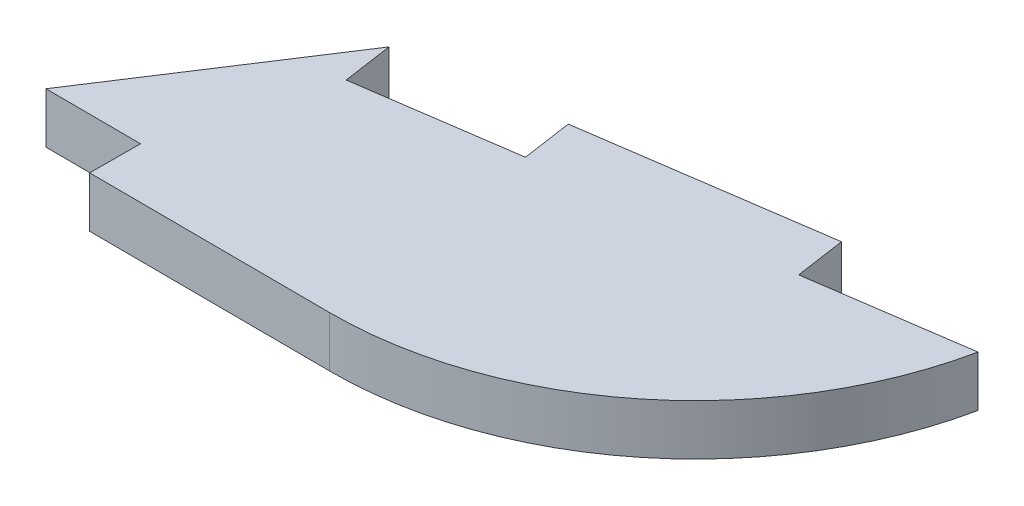
ISO-10303-21;
HEADER;
FILE_DESCRIPTION(('STEP AP214'),'2;1');
FILE_NAME('part.step','',(''),(''),'','','');
FILE_SCHEMA(('AUTOMOTIVE_DESIGN { 1 0 10303 214 1 1 1 1 }'));
ENDSEC;
DATA;
#1=APPLICATION_CONTEXT('core data for automotive mechanical design processes');
#2=APPLICATION_PROTOCOL_DEFINITION('international standard','automotive_design',2000,#1);
#3=PRODUCT_CONTEXT('',#1,'mechanical');
#4=PRODUCT('Part','Part','',(#3));
#5=PRODUCT_RELATED_PRODUCT_CATEGORY('part','',(#4));
#6=PRODUCT_DEFINITION_FORMATION('','',#4);
#7=PRODUCT_DEFINITION_CONTEXT('part definition',#1,'design');
#8=PRODUCT_DEFINITION('design','',#6,#7);
#9=PRODUCT_DEFINITION_SHAPE('','',#8);
#10=(LENGTH_UNIT() NAMED_UNIT(*) SI_UNIT(.MILLI.,.METRE.));
#11=(NAMED_UNIT(*) PLANE_ANGLE_UNIT() SI_UNIT($,.RADIAN.));
#12=(NAMED_UNIT(*) SI_UNIT($,.STERADIAN.) SOLID_ANGLE_UNIT());
#13=UNCERTAINTY_MEASURE_WITH_UNIT(LENGTH_MEASURE(1.E-05),#10,'distance_accuracy_value','');
#14=(GEOMETRIC_REPRESENTATION_CONTEXT(3) GLOBAL_UNCERTAINTY_ASSIGNED_CONTEXT((#13)) GLOBAL_UNIT_ASSIGNED_CONTEXT((#10,
#11,#12)) REPRESENTATION_CONTEXT('',''));
#15=CARTESIAN_POINT('',(0.,0.,0.));
#16=DIRECTION('',(0.,0.,1.));
#17=DIRECTION('',(1.,0.,0.));
#18=AXIS2_PLACEMENT_3D('',#15,#16,#17);
#19=CARTESIAN_POINT('',(18.5909943131763,0.8,-1.12747743329076));
#20=DIRECTION('',(0.00428128758795251,0.,-0.999990835246298));
#21=DIRECTION('',(-0.999990835246298,0.,-0.00428128758795251));
#22=AXIS2_PLACEMENT_3D('',#19,#20,#21);
#23=PLANE('',#22);
#24=DIRECTION('',(0.999990835246298,0.,0.00428128758795251));
#25=VECTOR('',#24,1.);
#26=CARTESIAN_POINT('',(18.5909943131763,-0.8,-1.12747743329076));
#27=LINE('',#26,#25);
#28=CARTESIAN_POINT('',(18.5909943131763,-0.8,-1.12747743329076));
#29=VERTEX_POINT('',#28);
#30=CARTESIAN_POINT('',(21.5909668189152,-0.8,-1.1146335705269));
#31=VERTEX_POINT('',#30);
#32=EDGE_CURVE('E149',#29,#31,#27,.T.);
#33=ORIENTED_EDGE('',*,*,#32,.T.);
#34=DIRECTION('',(0.,-1.,0.));
#35=VECTOR('',#34,1.);
#36=CARTESIAN_POINT('',(21.5909668189152,0.8,-1.1146335705269));
#37=LINE('',#36,#35);
#38=CARTESIAN_POINT('',(21.5909668189152,0.8,-1.1146335705269));
#39=VERTEX_POINT('',#38);
#40=EDGE_CURVE('E11',#39,#31,#37,.T.);
#41=ORIENTED_EDGE('',*,*,#40,.F.);
#42=DIRECTION('',(0.999990835246298,0.,0.00428128758795251));
#43=VECTOR('',#42,1.);
#44=CARTESIAN_POINT('',(18.5909943131763,0.8,-1.12747743329076));
#45=LINE('',#44,#43);
#46=CARTESIAN_POINT('',(18.5909943131763,0.8,-1.12747743329076));
#47=VERTEX_POINT('',#46);
#48=EDGE_CURVE('E169',#47,#39,#45,.T.);
#49=ORIENTED_EDGE('',*,*,#48,.F.);
#50=DIRECTION('',(0.,-1.,0.));
#51=VECTOR('',#50,1.);
#52=CARTESIAN_POINT('',(18.5909943131763,0.8,-1.12747743329076));
#53=LINE('',#52,#51);
#54=EDGE_CURVE('E145',#47,#29,#53,.T.);
#55=ORIENTED_EDGE('',*,*,#54,.T.);
#56=EDGE_LOOP('',(#33,#41,#49,#55));
#57=FACE_BOUND('',#56,.T.);
#58=ADVANCED_FACE('F35',(#57),#23,.F.);
#59=CARTESIAN_POINT('',(21.5909668189152,0.8,-1.1146335705269));
#60=DIRECTION('',(0.999990835246298,0.,0.00428128758795092));
#61=DIRECTION('',(0.00428128758795092,0.,-0.999990835246298));
#62=AXIS2_PLACEMENT_3D('',#59,#60,#61);
#63=PLANE('',#62);
#64=DIRECTION('',(-0.00428128758795092,0.,0.999990835246298));
#65=VECTOR('',#64,1.);
#66=CARTESIAN_POINT('',(21.5909668189152,-0.8,-1.1146335705269));
#67=LINE('',#66,#65);
#68=CARTESIAN_POINT('',(21.5841167587745,-0.8,0.485351765867176));
#69=VERTEX_POINT('',#68);
#70=EDGE_CURVE('E152',#31,#69,#67,.T.);
#71=ORIENTED_EDGE('',*,*,#70,.T.);
#72=DIRECTION('',(0.,-1.,0.));
#73=VECTOR('',#72,1.);
#74=CARTESIAN_POINT('',(21.5841167587745,0.8,0.485351765867176));
#75=LINE('',#74,#73);
#76=CARTESIAN_POINT('',(21.5841167587745,0.8,0.485351765867176));
#77=VERTEX_POINT('',#76);
#78=EDGE_CURVE('E43',#77,#69,#75,.T.);
#79=ORIENTED_EDGE('',*,*,#78,.F.);
#80=DIRECTION('',(-0.00428128758795092,0.,0.999990835246298));
#81=VECTOR('',#80,1.);
#82=CARTESIAN_POINT('',(21.5909668189152,0.8,-1.1146335705269));
#83=LINE('',#82,#81);
#84=EDGE_CURVE('E103',#39,#77,#83,.T.);
#85=ORIENTED_EDGE('',*,*,#84,.F.);
#86=ORIENTED_EDGE('',*,*,#40,.T.);
#87=EDGE_LOOP('',(#71,#79,#85,#86));
#88=FACE_BOUND('',#87,.T.);
#89=ADVANCED_FACE('F241',(#88),#63,.F.);
#90=CARTESIAN_POINT('',(21.5841167587745,0.8,0.485351765867176));
#91=DIRECTION('',(0.00428128758795139,0.,-0.999990835246298));
#92=DIRECTION('',(-0.999990835246298,0.,-0.00428128758795139));
#93=AXIS2_PLACEMENT_3D('',#90,#91,#92);
#94=PLANE('',#93);
#95=DIRECTION('',(0.999990835246298,0.,0.00428128758795139));
#96=VECTOR('',#95,1.);
#97=CARTESIAN_POINT('',(21.5841167587745,-0.8,0.485351765867176));
#98=LINE('',#97,#96);
#99=CARTESIAN_POINT('',(29.2040469233513,-0.8,0.517975177287365));
#100=VERTEX_POINT('',#99);
#101=EDGE_CURVE('E154',#69,#100,#98,.T.);
#102=ORIENTED_EDGE('',*,*,#101,.T.);
#103=DIRECTION('',(0.,-1.,0.));
#104=VECTOR('',#103,1.);
#105=CARTESIAN_POINT('',(29.2040469233513,0.8,0.517975177287365));
#106=LINE('',#105,#104);
#107=CARTESIAN_POINT('',(29.2040469233513,0.8,0.517975177287365));
#108=VERTEX_POINT('',#107);
#109=EDGE_CURVE('E185',#108,#100,#106,.T.);
#110=ORIENTED_EDGE('',*,*,#109,.F.);
#111=DIRECTION('',(0.999990835246298,0.,0.00428128758795139));
#112=VECTOR('',#111,1.);
#113=CARTESIAN_POINT('',(21.5841167587745,0.8,0.485351765867176));
#114=LINE('',#113,#112);
#115=EDGE_CURVE('E193',#77,#108,#114,.T.);
#116=ORIENTED_EDGE('',*,*,#115,.F.);
#117=ORIENTED_EDGE('',*,*,#78,.T.);
#118=EDGE_LOOP('',(#102,#110,#116,#117));
#119=FACE_BOUND('',#118,.T.);
#120=ADVANCED_FACE('F191',(#119),#94,.F.);
#121=CARTESIAN_POINT('',(29.2533795677285,0.8,-11.0047714829704));
#122=DIRECTION('',(0.,-1.,0.));
#123=DIRECTION('',(0.,0.,-1.));
#124=AXIS2_PLACEMENT_3D('',#121,#122,#123);
#125=CYLINDRICAL_SURFACE('',#124,11.5228522643607);
#126=CARTESIAN_POINT('',(29.2533795677285,-0.8,-11.0047714829704));
#127=DIRECTION('',(0.,1.,0.));
#128=DIRECTION('',(0.,0.,1.));
#129=AXIS2_PLACEMENT_3D('',#126,#127,#128);
#130=CIRCLE('',#129,11.5228522643607);
#131=CARTESIAN_POINT('',(40.5332201400788,-0.8,-8.65077042760888));
#132=VERTEX_POINT('',#131);
#133=EDGE_CURVE('E156',#100,#132,#130,.T.);
#134=ORIENTED_EDGE('',*,*,#133,.T.);
#135=DIRECTION('',(0.,-1.,0.));
#136=VECTOR('',#135,1.);
#137=CARTESIAN_POINT('',(40.5332201400788,0.8,-8.65077042760888));
#138=LINE('',#137,#136);
#139=CARTESIAN_POINT('',(40.5332201400788,0.8,-8.65077042760888));
#140=VERTEX_POINT('',#139);
#141=EDGE_CURVE('E182',#140,#132,#138,.T.);
#142=ORIENTED_EDGE('',*,*,#141,.F.);
#143=CARTESIAN_POINT('',(29.2533795677285,0.8,-11.0047714829704));
#144=DIRECTION('',(0.,1.,0.));
#145=DIRECTION('',(0.,0.,1.));
#146=AXIS2_PLACEMENT_3D('',#143,#144,#145);
#147=CIRCLE('',#146,11.5228522643607);
#148=EDGE_CURVE('E211',#108,#140,#147,.T.);
#149=ORIENTED_EDGE('',*,*,#148,.F.);
#150=ORIENTED_EDGE('',*,*,#109,.T.);
#151=EDGE_LOOP('',(#134,#142,#149,#150));
#152=FACE_BOUND('',#151,.T.);
#153=ADVANCED_FACE('F202',(#152),#125,.T.);
#154=CARTESIAN_POINT('',(40.5332201400788,0.8,-8.65077042760888));
#155=DIRECTION('',(0.144143926418042,0.,0.989556733329015));
#156=DIRECTION('',(0.989556733329014,0.,-0.144143926418042));
#157=AXIS2_PLACEMENT_3D('',#154,#155,#156);
#158=PLANE('',#157);
#159=DIRECTION('',(-0.989556733329015,0.,0.144143926418042));
#160=VECTOR('',#159,1.);
#161=CARTESIAN_POINT('',(40.5332201400788,-0.8,-8.65077042760888));
#162=LINE('',#161,#160);
#163=CARTESIAN_POINT('',(35.5854364734337,-0.8,-7.93005079551867));
#164=VERTEX_POINT('',#163);
#165=EDGE_CURVE('E158',#132,#164,#162,.T.);
#166=ORIENTED_EDGE('',*,*,#165,.T.);
#167=DIRECTION('',(0.,-1.,0.));
#168=VECTOR('',#167,1.);
#169=CARTESIAN_POINT('',(35.5854364734337,0.8,-7.93005079551867));
#170=LINE('',#169,#168);
#171=CARTESIAN_POINT('',(35.5854364734337,0.8,-7.93005079551867));
#172=VERTEX_POINT('',#171);
#173=EDGE_CURVE('E179',#172,#164,#170,.T.);
#174=ORIENTED_EDGE('',*,*,#173,.F.);
#175=DIRECTION('',(-0.989556733329015,0.,0.144143926418042));
#176=VECTOR('',#175,1.);
#177=CARTESIAN_POINT('',(40.5332201400788,0.8,-8.65077042760888));
#178=LINE('',#177,#176);
#179=EDGE_CURVE('E208',#140,#172,#178,.T.);
#180=ORIENTED_EDGE('',*,*,#179,.F.);
#181=ORIENTED_EDGE('',*,*,#141,.T.);
#182=EDGE_LOOP('',(#166,#174,#180,#181));
#183=FACE_BOUND('',#182,.T.);
#184=ADVANCED_FACE('F206',(#183),#158,.F.);
#185=CARTESIAN_POINT('',(35.5854364734337,0.8,-7.93005079551867));
#186=DIRECTION('',(-0.989556733329015,0.,0.144143926418036));
#187=DIRECTION('',(0.144143926418036,0.,0.989556733329015));
#188=AXIS2_PLACEMENT_3D('',#185,#186,#187);
#189=PLANE('',#188);
#190=DIRECTION('',(-0.144143926418036,0.,-0.989556733329015));
#191=VECTOR('',#190,1.);
#192=CARTESIAN_POINT('',(35.5854364734337,-0.8,-7.93005079551867));
#193=LINE('',#192,#191);
#194=CARTESIAN_POINT('',(35.3548061911649,-0.8,-9.5133415688451));
#195=VERTEX_POINT('',#194);
#196=EDGE_CURVE('E160',#164,#195,#193,.T.);
#197=ORIENTED_EDGE('',*,*,#196,.T.);
#198=DIRECTION('',(0.,-1.,0.));
#199=VECTOR('',#198,1.);
#200=CARTESIAN_POINT('',(35.3548061911649,0.8,-9.5133415688451));
#201=LINE('',#200,#199);
#202=CARTESIAN_POINT('',(35.3548061911649,0.8,-9.5133415688451));
#203=VERTEX_POINT('',#202);
#204=EDGE_CURVE('E176',#203,#195,#201,.T.);
#205=ORIENTED_EDGE('',*,*,#204,.F.);
#206=DIRECTION('',(-0.144143926418036,0.,-0.989556733329015));
#207=VECTOR('',#206,1.);
#208=CARTESIAN_POINT('',(35.5854364734337,0.8,-7.93005079551867));
#209=LINE('',#208,#207);
#210=EDGE_CURVE('E210',#172,#203,#209,.T.);
#211=ORIENTED_EDGE('',*,*,#210,.F.);
#212=ORIENTED_EDGE('',*,*,#173,.T.);
#213=EDGE_LOOP('',(#197,#205,#211,#212));
#214=FACE_BOUND('',#213,.T.);
#215=ADVANCED_FACE('F254',(#214),#189,.F.);
#216=CARTESIAN_POINT('',(35.3548061911649,0.8,-9.5133415688451));
#217=DIRECTION('',(0.144143926418041,0.,0.989556733329014));
#218=DIRECTION('',(0.989556733329015,0.,-0.144143926418042));
#219=AXIS2_PLACEMENT_3D('',#216,#217,#218);
#220=PLANE('',#219);
#221=DIRECTION('',(-0.989556733329014,0.,0.144143926418041));
#222=VECTOR('',#221,1.);
#223=CARTESIAN_POINT('',(35.3548061911649,-0.8,-9.5133415688451));
#224=LINE('',#223,#222);
#225=CARTESIAN_POINT('',(27.8143838831978,-0.8,-8.41496484953962));
#226=VERTEX_POINT('',#225);
#227=EDGE_CURVE('E162',#195,#226,#224,.T.);
#228=ORIENTED_EDGE('',*,*,#227,.T.);
#229=DIRECTION('',(0.,-1.,0.));
#230=VECTOR('',#229,1.);
#231=CARTESIAN_POINT('',(27.8143838831978,0.8,-8.41496484953962));
#232=LINE('',#231,#230);
#233=CARTESIAN_POINT('',(27.8143838831978,0.8,-8.41496484953962));
#234=VERTEX_POINT('',#233);
#235=EDGE_CURVE('E173',#234,#226,#232,.T.);
#236=ORIENTED_EDGE('',*,*,#235,.F.);
#237=DIRECTION('',(-0.989556733329014,0.,0.144143926418041));
#238=VECTOR('',#237,1.);
#239=CARTESIAN_POINT('',(35.3548061911649,0.8,-9.5133415688451));
#240=LINE('',#239,#238);
#241=EDGE_CURVE('E213',#203,#234,#240,.T.);
#242=ORIENTED_EDGE('',*,*,#241,.F.);
#243=ORIENTED_EDGE('',*,*,#204,.T.);
#244=EDGE_LOOP('',(#228,#236,#242,#243));
#245=FACE_BOUND('',#244,.T.);
#246=ADVANCED_FACE('F222',(#245),#220,.F.);
#247=CARTESIAN_POINT('',(27.8143838831978,0.8,-8.41496484953962));
#248=DIRECTION('',(0.989556733329016,0.,-0.144143926418035));
#249=DIRECTION('',(-0.144143926418035,0.,-0.989556733329016));
#250=AXIS2_PLACEMENT_3D('',#247,#248,#249);
#251=PLANE('',#250);
#252=DIRECTION('',(0.144143926418035,0.,0.989556733329016));
#253=VECTOR('',#252,1.);
#254=CARTESIAN_POINT('',(27.8143838831978,-0.8,-8.41496484953962));
#255=LINE('',#254,#253);
#256=CARTESIAN_POINT('',(28.0450141654666,-0.8,-6.83167407621319));
#257=VERTEX_POINT('',#256);
#258=EDGE_CURVE('E164',#226,#257,#255,.T.);
#259=ORIENTED_EDGE('',*,*,#258,.T.);
#260=DIRECTION('',(0.,-1.,0.));
#261=VECTOR('',#260,1.);
#262=CARTESIAN_POINT('',(28.0450141654666,0.8,-6.83167407621319));
#263=LINE('',#262,#261);
#264=CARTESIAN_POINT('',(28.0450141654666,0.8,-6.83167407621319));
#265=VERTEX_POINT('',#264);
#266=EDGE_CURVE('E140',#265,#257,#263,.T.);
#267=ORIENTED_EDGE('',*,*,#266,.F.);
#268=DIRECTION('',(0.144143926418035,0.,0.989556733329016));
#269=VECTOR('',#268,1.);
#270=CARTESIAN_POINT('',(27.8143838831978,0.8,-8.41496484953962));
#271=LINE('',#270,#269);
#272=EDGE_CURVE('E131',#234,#265,#271,.T.);
#273=ORIENTED_EDGE('',*,*,#272,.F.);
#274=ORIENTED_EDGE('',*,*,#235,.T.);
#275=EDGE_LOOP('',(#259,#267,#273,#274));
#276=FACE_BOUND('',#275,.T.);
#277=ADVANCED_FACE('F226',(#276),#251,.F.);
#278=CARTESIAN_POINT('',(28.0450141654666,0.8,-6.83167407621319));
#279=DIRECTION('',(0.14414392641804,0.,0.989556733329015));
#280=DIRECTION('',(0.989556733329015,0.,-0.14414392641804));
#281=AXIS2_PLACEMENT_3D('',#278,#279,#280);
#282=PLANE('',#281);
#283=DIRECTION('',(-0.989556733329015,0.,0.14414392641804));
#284=VECTOR('',#283,1.);
#285=CARTESIAN_POINT('',(28.0450141654666,-0.8,-6.83167407621319));
#286=LINE('',#285,#284);
#287=CARTESIAN_POINT('',(23.0972304988216,-0.8,-6.11095444412299));
#288=VERTEX_POINT('',#287);
#289=EDGE_CURVE('E139',#257,#288,#286,.T.);
#290=ORIENTED_EDGE('',*,*,#289,.T.);
#291=DIRECTION('',(0.,-1.,0.));
#292=VECTOR('',#291,1.);
#293=CARTESIAN_POINT('',(23.0972304988216,0.8,-6.11095444412299));
#294=LINE('',#293,#292);
#295=CARTESIAN_POINT('',(23.0972304988216,0.8,-6.11095444412299));
#296=VERTEX_POINT('',#295);
#297=EDGE_CURVE('E136',#296,#288,#294,.T.);
#298=ORIENTED_EDGE('',*,*,#297,.F.);
#299=DIRECTION('',(-0.989556733329015,0.,0.14414392641804));
#300=VECTOR('',#299,1.);
#301=CARTESIAN_POINT('',(28.0450141654666,0.8,-6.83167407621319));
#302=LINE('',#301,#300);
#303=EDGE_CURVE('E125',#265,#296,#302,.T.);
#304=ORIENTED_EDGE('',*,*,#303,.F.);
#305=ORIENTED_EDGE('',*,*,#266,.T.);
#306=EDGE_LOOP('',(#290,#298,#304,#305));
#307=FACE_BOUND('',#306,.T.);
#308=ADVANCED_FACE('F137',(#307),#282,.F.);
#309=CARTESIAN_POINT('',(23.0972304988216,0.8,-6.11095444412299));
#310=DIRECTION('',(-0.989556733329015,0.,0.144143926418036));
#311=DIRECTION('',(0.144143926418036,0.,0.989556733329015));
#312=AXIS2_PLACEMENT_3D('',#309,#310,#311);
#313=PLANE('',#312);
#314=DIRECTION('',(-0.144143926418036,0.,-0.989556733329015));
#315=VECTOR('',#314,1.);
#316=CARTESIAN_POINT('',(23.0972304988216,-0.8,-6.11095444412299));
#317=LINE('',#316,#315);
#318=CARTESIAN_POINT('',(22.8666002165527,-0.8,-7.69424521744941));
#319=VERTEX_POINT('',#318);
#320=EDGE_CURVE('E89',#288,#319,#317,.T.);
#321=ORIENTED_EDGE('',*,*,#320,.T.);
#322=DIRECTION('',(0.,-1.,0.));
#323=VECTOR('',#322,1.);
#324=CARTESIAN_POINT('',(22.8666002165527,0.8,-7.69424521744941));
#325=LINE('',#324,#323);
#326=CARTESIAN_POINT('',(22.8666002165527,0.8,-7.69424521744941));
#327=VERTEX_POINT('',#326);
#328=EDGE_CURVE('E141',#327,#319,#325,.T.);
#329=ORIENTED_EDGE('',*,*,#328,.F.);
#330=DIRECTION('',(-0.144143926418036,0.,-0.989556733329015));
#331=VECTOR('',#330,1.);
#332=CARTESIAN_POINT('',(23.0972304988216,0.8,-6.11095444412299));
#333=LINE('',#332,#331);
#334=EDGE_CURVE('E129',#296,#327,#333,.T.);
#335=ORIENTED_EDGE('',*,*,#334,.F.);
#336=ORIENTED_EDGE('',*,*,#297,.T.);
#337=EDGE_LOOP('',(#321,#329,#335,#336));
#338=FACE_BOUND('',#337,.T.);
#339=ADVANCED_FACE('F143',(#338),#313,.F.);
#340=CARTESIAN_POINT('',(22.8666002165527,0.8,-7.69424521744941));
#341=DIRECTION('',(0.838023114309665,0.,0.545634731191784));
#342=DIRECTION('',(0.545634731191784,0.,-0.838023114309665));
#343=AXIS2_PLACEMENT_3D('',#340,#341,#342);
#344=PLANE('',#343);
#345=DIRECTION('',(-0.545634731191784,0.,0.838023114309665));
#346=VECTOR('',#345,1.);
#347=CARTESIAN_POINT('',(22.8666002165527,-0.8,-7.69424521744941));
#348=LINE('',#347,#346);
#349=EDGE_CURVE('E95',#319,#29,#348,.T.);
#350=ORIENTED_EDGE('',*,*,#349,.T.);
#351=ORIENTED_EDGE('',*,*,#54,.F.);
#352=DIRECTION('',(-0.545634731191784,0.,0.838023114309665));
#353=VECTOR('',#352,1.);
#354=CARTESIAN_POINT('',(22.8666002165527,0.8,-7.69424521744941));
#355=LINE('',#354,#353);
#356=EDGE_CURVE('E51',#327,#47,#355,.T.);
#357=ORIENTED_EDGE('',*,*,#356,.F.);
#358=ORIENTED_EDGE('',*,*,#328,.T.);
#359=EDGE_LOOP('',(#350,#351,#357,#358));
#360=FACE_BOUND('',#359,.T.);
#361=ADVANCED_FACE('F230',(#360),#344,.F.);
#362=CARTESIAN_POINT('',(29.2533795677285,0.8,-11.0047714829704));
#363=DIRECTION('',(0.,1.,0.));
#364=DIRECTION('',(0.,0.,1.));
#365=AXIS2_PLACEMENT_3D('',#362,#363,#364);
#366=PLANE('',#365);
#367=ORIENTED_EDGE('',*,*,#48,.T.);
#368=ORIENTED_EDGE('',*,*,#84,.T.);
#369=ORIENTED_EDGE('',*,*,#115,.T.);
#370=ORIENTED_EDGE('',*,*,#148,.T.);
#371=ORIENTED_EDGE('',*,*,#179,.T.);
#372=ORIENTED_EDGE('',*,*,#210,.T.);
#373=ORIENTED_EDGE('',*,*,#241,.T.);
#374=ORIENTED_EDGE('',*,*,#272,.T.);
#375=ORIENTED_EDGE('',*,*,#303,.T.);
#376=ORIENTED_EDGE('',*,*,#334,.T.);
#377=ORIENTED_EDGE('',*,*,#356,.T.);
#378=EDGE_LOOP('',(#367,#368,#369,#370,#371,#372,#373,#374,#375,#376,#377));
#379=FACE_BOUND('',#378,.T.);
#380=ADVANCED_FACE('F127',(#379),#366,.T.);
#381=CARTESIAN_POINT('',(29.2533795677285,-0.8,-11.0047714829704));
#382=DIRECTION('',(0.,1.,0.));
#383=DIRECTION('',(0.,0.,1.));
#384=AXIS2_PLACEMENT_3D('',#381,#382,#383);
#385=PLANE('',#384);
#386=ORIENTED_EDGE('',*,*,#32,.F.);
#387=ORIENTED_EDGE('',*,*,#349,.F.);
#388=ORIENTED_EDGE('',*,*,#320,.F.);
#389=ORIENTED_EDGE('',*,*,#289,.F.);
#390=ORIENTED_EDGE('',*,*,#258,.F.);
#391=ORIENTED_EDGE('',*,*,#227,.F.);
#392=ORIENTED_EDGE('',*,*,#196,.F.);
#393=ORIENTED_EDGE('',*,*,#165,.F.);
#394=ORIENTED_EDGE('',*,*,#133,.F.);
#395=ORIENTED_EDGE('',*,*,#101,.F.);
#396=ORIENTED_EDGE('',*,*,#70,.F.);
#397=EDGE_LOOP('',(#386,#387,#388,#389,#390,#391,#392,#393,#394,#395,#396));
#398=FACE_BOUND('',#397,.T.);
#399=ADVANCED_FACE('F197',(#398),#385,.F.);
#400=CLOSED_SHELL('',(#58,#89,#120,#153,#184,#215,#246,#277,#308,#339,#361,#380,#399));
#401=MANIFOLD_SOLID_BREP('B2',#400);
#402=ADVANCED_BREP_SHAPE_REPRESENTATION('',(#18,#401),#14);
#403=SHAPE_DEFINITION_REPRESENTATION(#9,#402);
ENDSEC;
END-ISO-10303-21;
